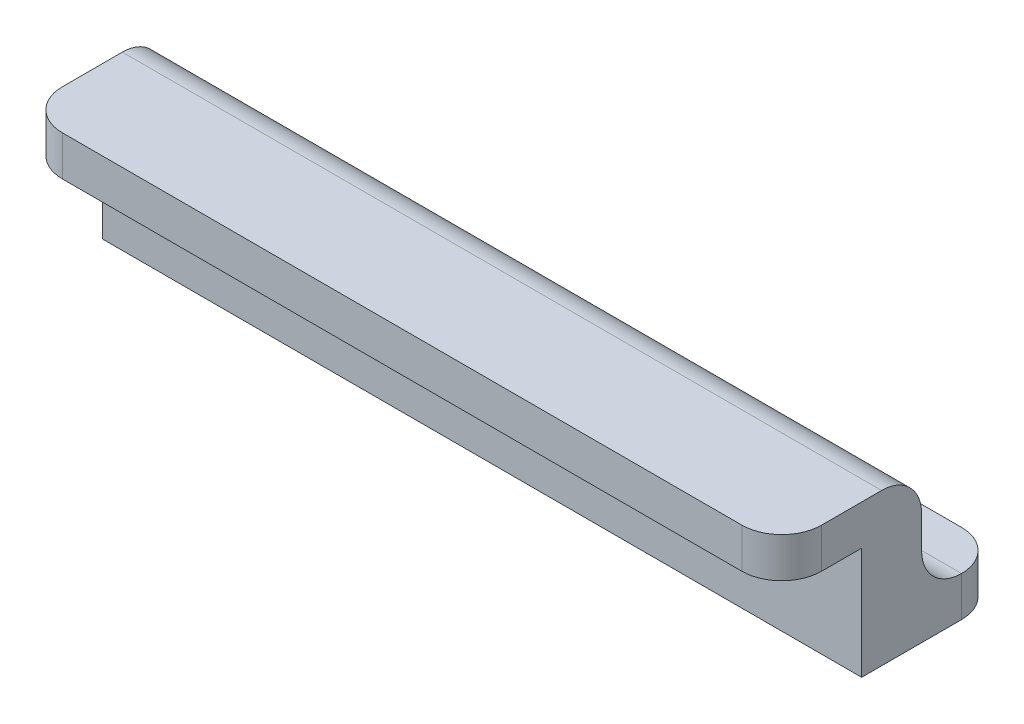
ISO-10303-21;
HEADER;
FILE_DESCRIPTION(('STEP AP214'),'2;1');
FILE_NAME('part.step','',(''),(''),'','','');
FILE_SCHEMA(('AUTOMOTIVE_DESIGN { 1 0 10303 214 1 1 1 1 }'));
ENDSEC;
DATA;
#1=APPLICATION_CONTEXT('core data for automotive mechanical design processes');
#2=APPLICATION_PROTOCOL_DEFINITION('international standard','automotive_design',2000,#1);
#3=PRODUCT_CONTEXT('',#1,'mechanical');
#4=PRODUCT('Part','Part','',(#3));
#5=PRODUCT_RELATED_PRODUCT_CATEGORY('part','',(#4));
#6=PRODUCT_DEFINITION_FORMATION('','',#4);
#7=PRODUCT_DEFINITION_CONTEXT('part definition',#1,'design');
#8=PRODUCT_DEFINITION('design','',#6,#7);
#9=PRODUCT_DEFINITION_SHAPE('','',#8);
#10=(LENGTH_UNIT() NAMED_UNIT(*) SI_UNIT(.MILLI.,.METRE.));
#11=(NAMED_UNIT(*) PLANE_ANGLE_UNIT() SI_UNIT($,.RADIAN.));
#12=(NAMED_UNIT(*) SI_UNIT($,.STERADIAN.) SOLID_ANGLE_UNIT());
#13=UNCERTAINTY_MEASURE_WITH_UNIT(LENGTH_MEASURE(1.E-05),#10,'distance_accuracy_value','');
#14=(GEOMETRIC_REPRESENTATION_CONTEXT(3) GLOBAL_UNCERTAINTY_ASSIGNED_CONTEXT((#13)) GLOBAL_UNIT_ASSIGNED_CONTEXT((#10,
#11,#12)) REPRESENTATION_CONTEXT('',''));
#15=CARTESIAN_POINT('',(0.,0.,0.));
#16=DIRECTION('',(0.,0.,1.));
#17=DIRECTION('',(1.,0.,0.));
#18=AXIS2_PLACEMENT_3D('',#15,#16,#17);
#19=CARTESIAN_POINT('',(0.,2.,-2.));
#20=DIRECTION('',(1.,0.,0.));
#21=DIRECTION('',(0.,0.,-1.));
#22=AXIS2_PLACEMENT_3D('',#19,#20,#21);
#23=PLANE('',#22);
#24=DIRECTION('',(0.,0.,1.));
#25=VECTOR('',#24,1.);
#26=CARTESIAN_POINT('',(0.,2.,-2.));
#27=LINE('',#26,#25);
#28=CARTESIAN_POINT('',(0.,2.,-5.));
#29=VERTEX_POINT('',#28);
#30=CARTESIAN_POINT('',(0.,2.,-2.));
#31=VERTEX_POINT('',#30);
#32=EDGE_CURVE('E189',#29,#31,#27,.T.);
#33=ORIENTED_EDGE('',*,*,#32,.F.);
#34=CARTESIAN_POINT('',(0.,0.,-5.));
#35=DIRECTION('',(1.,0.,0.));
#36=DIRECTION('',(0.,0.,-1.));
#37=AXIS2_PLACEMENT_3D('',#34,#35,#36);
#38=CIRCLE('',#37,2.);
#39=CARTESIAN_POINT('',(0.,0.,-7.));
#40=VERTEX_POINT('',#39);
#41=EDGE_CURVE('E222',#29,#40,#38,.F.);
#42=ORIENTED_EDGE('',*,*,#41,.T.);
#43=DIRECTION('',(0.,-1.,0.));
#44=VECTOR('',#43,1.);
#45=CARTESIAN_POINT('',(0.,40.1182371050918,-7.));
#46=LINE('',#45,#44);
#47=CARTESIAN_POINT('',(0.,-1.59999999999996,-7.));
#48=VERTEX_POINT('',#47);
#49=EDGE_CURVE('E157',#40,#48,#46,.T.);
#50=ORIENTED_EDGE('',*,*,#49,.T.);
#51=CARTESIAN_POINT('',(0.,-1.59999999999998,-9.));
#52=DIRECTION('',(1.,0.,0.));
#53=DIRECTION('',(0.,0.,-1.));
#54=AXIS2_PLACEMENT_3D('',#51,#52,#53);
#55=CIRCLE('',#54,2.);
#56=CARTESIAN_POINT('',(0.,-3.59999999999998,-9.00000000000001));
#57=VERTEX_POINT('',#56);
#58=EDGE_CURVE('E41',#48,#57,#55,.T.);
#59=ORIENTED_EDGE('',*,*,#58,.T.);
#60=DIRECTION('',(0.,-1.,0.));
#61=VECTOR('',#60,1.);
#62=CARTESIAN_POINT('',(0.,-3.59999999999998,-9.00000000000001));
#63=LINE('',#62,#61);
#64=CARTESIAN_POINT('',(0.,-5.59999999999998,-9.00000000000002));
#65=VERTEX_POINT('',#64);
#66=EDGE_CURVE('E174',#57,#65,#63,.T.);
#67=ORIENTED_EDGE('',*,*,#66,.T.);
#68=DIRECTION('',(0.,0.,1.));
#69=VECTOR('',#68,1.);
#70=CARTESIAN_POINT('',(0.,-5.6,-6.));
#71=LINE('',#70,#69);
#72=CARTESIAN_POINT('',(0.,-5.6,-4.));
#73=VERTEX_POINT('',#72);
#74=EDGE_CURVE('E138',#65,#73,#71,.T.);
#75=ORIENTED_EDGE('',*,*,#74,.T.);
#76=DIRECTION('',(0.,-1.,0.));
#77=VECTOR('',#76,1.);
#78=CARTESIAN_POINT('',(0.,40.1182371050918,-4.));
#79=LINE('',#78,#77);
#80=CARTESIAN_POINT('',(0.,0.,-4.));
#81=VERTEX_POINT('',#80);
#82=EDGE_CURVE('E148',#81,#73,#79,.T.);
#83=ORIENTED_EDGE('',*,*,#82,.F.);
#84=DIRECTION('',(0.,0.,-1.));
#85=VECTOR('',#84,1.);
#86=CARTESIAN_POINT('',(0.,0.,-5.80000000000001));
#87=LINE('',#86,#85);
#88=CARTESIAN_POINT('',(0.,0.,-2.));
#89=VERTEX_POINT('',#88);
#90=EDGE_CURVE('E162',#89,#81,#87,.T.);
#91=ORIENTED_EDGE('',*,*,#90,.F.);
#92=DIRECTION('',(0.,-1.,0.));
#93=VECTOR('',#92,1.);
#94=CARTESIAN_POINT('',(0.,2.,-2.));
#95=LINE('',#94,#93);
#96=EDGE_CURVE('E214',#31,#89,#95,.T.);
#97=ORIENTED_EDGE('',*,*,#96,.F.);
#98=EDGE_LOOP('',(#33,#42,#50,#59,#67,#75,#83,#91,#97));
#99=FACE_BOUND('',#98,.T.);
#100=ADVANCED_FACE('F33',(#99),#23,.F.);
#101=CARTESIAN_POINT('',(2.,2.,-2.));
#102=DIRECTION('',(0.,-1.,0.));
#103=DIRECTION('',(0.,0.,-1.));
#104=AXIS2_PLACEMENT_3D('',#101,#102,#103);
#105=CYLINDRICAL_SURFACE('',#104,2.);
#106=ORIENTED_EDGE('',*,*,#96,.T.);
#107=CARTESIAN_POINT('',(2.,0.,-2.));
#108=DIRECTION('',(0.,1.,0.));
#109=DIRECTION('',(0.,0.,-1.));
#110=AXIS2_PLACEMENT_3D('',#107,#108,#109);
#111=CIRCLE('',#110,2.);
#112=CARTESIAN_POINT('',(2.,0.,0.));
#113=VERTEX_POINT('',#112);
#114=EDGE_CURVE('E137',#89,#113,#111,.T.);
#115=ORIENTED_EDGE('',*,*,#114,.T.);
#116=DIRECTION('',(0.,-1.,0.));
#117=VECTOR('',#116,1.);
#118=CARTESIAN_POINT('',(2.,2.,0.));
#119=LINE('',#118,#117);
#120=CARTESIAN_POINT('',(2.,2.,0.));
#121=VERTEX_POINT('',#120);
#122=EDGE_CURVE('E211',#121,#113,#119,.T.);
#123=ORIENTED_EDGE('',*,*,#122,.F.);
#124=CARTESIAN_POINT('',(2.,2.,-2.));
#125=DIRECTION('',(0.,1.,0.));
#126=DIRECTION('',(0.,0.,-1.));
#127=AXIS2_PLACEMENT_3D('',#124,#125,#126);
#128=CIRCLE('',#127,2.);
#129=EDGE_CURVE('E191',#31,#121,#128,.T.);
#130=ORIENTED_EDGE('',*,*,#129,.F.);
#131=EDGE_LOOP('',(#106,#115,#123,#130));
#132=FACE_BOUND('',#131,.T.);
#133=ADVANCED_FACE('F258',(#132),#105,.T.);
#134=CARTESIAN_POINT('',(36.,2.,-2.));
#135=DIRECTION('',(0.,-1.,0.));
#136=DIRECTION('',(0.,0.,-1.));
#137=AXIS2_PLACEMENT_3D('',#134,#135,#136);
#138=CYLINDRICAL_SURFACE('',#137,2.);
#139=CARTESIAN_POINT('',(36.,0.,-2.));
#140=DIRECTION('',(0.,1.,0.));
#141=DIRECTION('',(0.,0.,1.));
#142=AXIS2_PLACEMENT_3D('',#139,#140,#141);
#143=CIRCLE('',#142,2.);
#144=CARTESIAN_POINT('',(36.,0.,0.));
#145=VERTEX_POINT('',#144);
#146=CARTESIAN_POINT('',(38.,0.,-2.));
#147=VERTEX_POINT('',#146);
#148=EDGE_CURVE('E192',#145,#147,#143,.T.);
#149=ORIENTED_EDGE('',*,*,#148,.T.);
#150=DIRECTION('',(0.,-1.,0.));
#151=VECTOR('',#150,1.);
#152=CARTESIAN_POINT('',(38.,2.,-2.));
#153=LINE('',#152,#151);
#154=CARTESIAN_POINT('',(38.,2.,-2.));
#155=VERTEX_POINT('',#154);
#156=EDGE_CURVE('E201',#155,#147,#153,.T.);
#157=ORIENTED_EDGE('',*,*,#156,.F.);
#158=CARTESIAN_POINT('',(36.,2.,-2.));
#159=DIRECTION('',(0.,1.,0.));
#160=DIRECTION('',(0.,0.,1.));
#161=AXIS2_PLACEMENT_3D('',#158,#159,#160);
#162=CIRCLE('',#161,2.);
#163=CARTESIAN_POINT('',(36.,2.,0.));
#164=VERTEX_POINT('',#163);
#165=EDGE_CURVE('E196',#164,#155,#162,.T.);
#166=ORIENTED_EDGE('',*,*,#165,.F.);
#167=DIRECTION('',(0.,-1.,0.));
#168=VECTOR('',#167,1.);
#169=CARTESIAN_POINT('',(36.,2.,0.));
#170=LINE('',#169,#168);
#171=EDGE_CURVE('E208',#164,#145,#170,.T.);
#172=ORIENTED_EDGE('',*,*,#171,.T.);
#173=EDGE_LOOP('',(#149,#157,#166,#172));
#174=FACE_BOUND('',#173,.T.);
#175=ADVANCED_FACE('F268',(#174),#138,.T.);
#176=CARTESIAN_POINT('',(38.,2.,-2.));
#177=DIRECTION('',(-1.,0.,0.));
#178=DIRECTION('',(0.,0.,1.));
#179=AXIS2_PLACEMENT_3D('',#176,#177,#178);
#180=PLANE('',#179);
#181=DIRECTION('',(0.,-1.,0.));
#182=VECTOR('',#181,1.);
#183=CARTESIAN_POINT('',(38.,40.1182371050918,-7.));
#184=LINE('',#183,#182);
#185=CARTESIAN_POINT('',(38.,0.,-7.));
#186=VERTEX_POINT('',#185);
#187=CARTESIAN_POINT('',(38.,-1.5999999999997,-7.));
#188=VERTEX_POINT('',#187);
#189=EDGE_CURVE('E155',#186,#188,#184,.T.);
#190=ORIENTED_EDGE('',*,*,#189,.F.);
#191=CARTESIAN_POINT('',(38.,0.,-5.));
#192=DIRECTION('',(-1.,0.,0.));
#193=DIRECTION('',(0.,0.,1.));
#194=AXIS2_PLACEMENT_3D('',#191,#192,#193);
#195=CIRCLE('',#194,2.);
#196=CARTESIAN_POINT('',(38.,2.,-5.));
#197=VERTEX_POINT('',#196);
#198=EDGE_CURVE('E228',#186,#197,#195,.F.);
#199=ORIENTED_EDGE('',*,*,#198,.T.);
#200=DIRECTION('',(0.,0.,-1.));
#201=VECTOR('',#200,1.);
#202=CARTESIAN_POINT('',(38.,2.,-2.));
#203=LINE('',#202,#201);
#204=EDGE_CURVE('E198',#155,#197,#203,.T.);
#205=ORIENTED_EDGE('',*,*,#204,.F.);
#206=ORIENTED_EDGE('',*,*,#156,.T.);
#207=DIRECTION('',(0.,0.,1.));
#208=VECTOR('',#207,1.);
#209=CARTESIAN_POINT('',(38.,0.,-5.8));
#210=LINE('',#209,#208);
#211=CARTESIAN_POINT('',(38.,0.,-4.));
#212=VERTEX_POINT('',#211);
#213=EDGE_CURVE('E145',#212,#147,#210,.T.);
#214=ORIENTED_EDGE('',*,*,#213,.F.);
#215=DIRECTION('',(0.,-1.,0.));
#216=VECTOR('',#215,1.);
#217=CARTESIAN_POINT('',(38.,40.1182371050918,-4.));
#218=LINE('',#217,#216);
#219=CARTESIAN_POINT('',(38.,-5.6,-4.));
#220=VERTEX_POINT('',#219);
#221=EDGE_CURVE('E142',#212,#220,#218,.T.);
#222=ORIENTED_EDGE('',*,*,#221,.T.);
#223=DIRECTION('',(0.,0.,-1.));
#224=VECTOR('',#223,1.);
#225=CARTESIAN_POINT('',(38.,-5.6,-6.));
#226=LINE('',#225,#224);
#227=CARTESIAN_POINT('',(38.,-5.59999999999971,-9.00000000000002));
#228=VERTEX_POINT('',#227);
#229=EDGE_CURVE('E128',#220,#228,#226,.T.);
#230=ORIENTED_EDGE('',*,*,#229,.T.);
#231=DIRECTION('',(0.,-1.,0.));
#232=VECTOR('',#231,1.);
#233=CARTESIAN_POINT('',(38.,-3.59999999999971,-9.00000000000001));
#234=LINE('',#233,#232);
#235=CARTESIAN_POINT('',(38.,-3.59999999999971,-9.00000000000001));
#236=VERTEX_POINT('',#235);
#237=EDGE_CURVE('E180',#236,#228,#234,.T.);
#238=ORIENTED_EDGE('',*,*,#237,.F.);
#239=CARTESIAN_POINT('',(38.,-1.59999999999971,-9.));
#240=DIRECTION('',(-1.,0.,0.));
#241=DIRECTION('',(0.,0.,1.));
#242=AXIS2_PLACEMENT_3D('',#239,#240,#241);
#243=CIRCLE('',#242,2.);
#244=EDGE_CURVE('E11',#236,#188,#243,.T.);
#245=ORIENTED_EDGE('',*,*,#244,.T.);
#246=EDGE_LOOP('',(#190,#199,#205,#206,#214,#222,#230,#238,#245));
#247=FACE_BOUND('',#246,.T.);
#248=ADVANCED_FACE('F143',(#247),#180,.F.);
#249=CARTESIAN_POINT('',(1.,-5.6,-6.));
#250=DIRECTION('',(0.,1.,0.));
#251=DIRECTION('',(0.,0.,1.));
#252=AXIS2_PLACEMENT_3D('',#249,#250,#251);
#253=PLANE('',#252);
#254=CARTESIAN_POINT('',(36.,-5.59999999999973,-9.00000000000002));
#255=DIRECTION('',(0.,-1.,0.));
#256=DIRECTION('',(1.,0.,0.));
#257=AXIS2_PLACEMENT_3D('',#254,#255,#256);
#258=CIRCLE('',#257,2.);
#259=CARTESIAN_POINT('',(36.,-5.59999999999972,-11.));
#260=VERTEX_POINT('',#259);
#261=EDGE_CURVE('E135',#260,#228,#258,.T.);
#262=ORIENTED_EDGE('',*,*,#261,.T.);
#263=ORIENTED_EDGE('',*,*,#229,.F.);
#264=DIRECTION('',(-1.,0.,0.));
#265=VECTOR('',#264,1.);
#266=CARTESIAN_POINT('',(38.,-5.6,-4.));
#267=LINE('',#266,#265);
#268=EDGE_CURVE('E132',#220,#73,#267,.T.);
#269=ORIENTED_EDGE('',*,*,#268,.T.);
#270=ORIENTED_EDGE('',*,*,#74,.F.);
#271=CARTESIAN_POINT('',(2.,-5.59999999999997,-9.00000000000002));
#272=DIRECTION('',(0.,-1.,0.));
#273=DIRECTION('',(1.,0.,0.));
#274=AXIS2_PLACEMENT_3D('',#271,#272,#273);
#275=CIRCLE('',#274,2.);
#276=CARTESIAN_POINT('',(2.,-5.59999999999996,-11.));
#277=VERTEX_POINT('',#276);
#278=EDGE_CURVE('E164',#65,#277,#275,.T.);
#279=ORIENTED_EDGE('',*,*,#278,.T.);
#280=DIRECTION('',(1.,0.,0.));
#281=VECTOR('',#280,1.);
#282=CARTESIAN_POINT('',(2.,-5.59999999999996,-11.));
#283=LINE('',#282,#281);
#284=EDGE_CURVE('E177',#277,#260,#283,.T.);
#285=ORIENTED_EDGE('',*,*,#284,.T.);
#286=EDGE_LOOP('',(#262,#263,#269,#270,#279,#285));
#287=FACE_BOUND('',#286,.T.);
#288=ADVANCED_FACE('F130',(#287),#253,.F.);
#289=CARTESIAN_POINT('',(1.,2.,-7.));
#290=DIRECTION('',(0.,0.,1.));
#291=DIRECTION('',(1.,0.,0.));
#292=AXIS2_PLACEMENT_3D('',#289,#290,#291);
#293=PLANE('',#292);
#294=ORIENTED_EDGE('',*,*,#49,.F.);
#295=DIRECTION('',(-1.,0.,0.));
#296=VECTOR('',#295,1.);
#297=CARTESIAN_POINT('',(1.,0.,-7.));
#298=LINE('',#297,#296);
#299=EDGE_CURVE('E53',#40,#186,#298,.F.);
#300=ORIENTED_EDGE('',*,*,#299,.T.);
#301=ORIENTED_EDGE('',*,*,#189,.T.);
#302=DIRECTION('',(-1.,0.,0.));
#303=VECTOR('',#302,1.);
#304=CARTESIAN_POINT('',(0.,-1.59999999999998,-7.));
#305=LINE('',#304,#303);
#306=EDGE_CURVE('E224',#188,#48,#305,.T.);
#307=ORIENTED_EDGE('',*,*,#306,.T.);
#308=EDGE_LOOP('',(#294,#300,#301,#307));
#309=FACE_BOUND('',#308,.T.);
#310=ADVANCED_FACE('F245',(#309),#293,.F.);
#311=CARTESIAN_POINT('',(2.,2.,0.));
#312=DIRECTION('',(0.,0.,-1.));
#313=DIRECTION('',(-1.,0.,0.));
#314=AXIS2_PLACEMENT_3D('',#311,#312,#313);
#315=PLANE('',#314);
#316=DIRECTION('',(1.,0.,0.));
#317=VECTOR('',#316,1.);
#318=CARTESIAN_POINT('',(2.,0.,0.));
#319=LINE('',#318,#317);
#320=EDGE_CURVE('E203',#113,#145,#319,.T.);
#321=ORIENTED_EDGE('',*,*,#320,.T.);
#322=ORIENTED_EDGE('',*,*,#171,.F.);
#323=DIRECTION('',(1.,0.,0.));
#324=VECTOR('',#323,1.);
#325=CARTESIAN_POINT('',(2.,2.,0.));
#326=LINE('',#325,#324);
#327=EDGE_CURVE('E194',#121,#164,#326,.T.);
#328=ORIENTED_EDGE('',*,*,#327,.F.);
#329=ORIENTED_EDGE('',*,*,#122,.T.);
#330=EDGE_LOOP('',(#321,#322,#328,#329));
#331=FACE_BOUND('',#330,.T.);
#332=ADVANCED_FACE('F264',(#331),#315,.F.);
#333=CARTESIAN_POINT('',(37.,2.,-6.));
#334=DIRECTION('',(0.,-1.,0.));
#335=DIRECTION('',(0.,0.,-1.));
#336=AXIS2_PLACEMENT_3D('',#333,#334,#335);
#337=PLANE('',#336);
#338=ORIENTED_EDGE('',*,*,#204,.T.);
#339=DIRECTION('',(-1.,0.,0.));
#340=VECTOR('',#339,1.);
#341=CARTESIAN_POINT('',(37.,2.,-5.));
#342=LINE('',#341,#340);
#343=EDGE_CURVE('E219',#197,#29,#342,.T.);
#344=ORIENTED_EDGE('',*,*,#343,.T.);
#345=ORIENTED_EDGE('',*,*,#32,.T.);
#346=ORIENTED_EDGE('',*,*,#129,.T.);
#347=ORIENTED_EDGE('',*,*,#327,.T.);
#348=ORIENTED_EDGE('',*,*,#165,.T.);
#349=EDGE_LOOP('',(#338,#344,#345,#346,#347,#348));
#350=FACE_BOUND('',#349,.T.);
#351=ADVANCED_FACE('F252',(#350),#337,.F.);
#352=CARTESIAN_POINT('',(37.,0.,-6.));
#353=DIRECTION('',(0.,-1.,0.));
#354=DIRECTION('',(0.,0.,-1.));
#355=AXIS2_PLACEMENT_3D('',#352,#353,#354);
#356=PLANE('',#355);
#357=DIRECTION('',(-1.,0.,0.));
#358=VECTOR('',#357,1.);
#359=CARTESIAN_POINT('',(37.,0.,-4.));
#360=LINE('',#359,#358);
#361=EDGE_CURVE('E217',#212,#81,#360,.T.);
#362=ORIENTED_EDGE('',*,*,#361,.F.);
#363=ORIENTED_EDGE('',*,*,#213,.T.);
#364=ORIENTED_EDGE('',*,*,#148,.F.);
#365=ORIENTED_EDGE('',*,*,#320,.F.);
#366=ORIENTED_EDGE('',*,*,#114,.F.);
#367=ORIENTED_EDGE('',*,*,#90,.T.);
#368=EDGE_LOOP('',(#362,#363,#364,#365,#366,#367));
#369=FACE_BOUND('',#368,.T.);
#370=ADVANCED_FACE('F270',(#369),#356,.T.);
#371=CARTESIAN_POINT('',(36.,-3.59999999999973,-9.00000000000001));
#372=DIRECTION('',(0.,-1.,0.));
#373=DIRECTION('',(1.,0.,0.));
#374=AXIS2_PLACEMENT_3D('',#371,#372,#373);
#375=CYLINDRICAL_SURFACE('',#374,2.);
#376=ORIENTED_EDGE('',*,*,#261,.F.);
#377=DIRECTION('',(0.,-1.,0.));
#378=VECTOR('',#377,1.);
#379=CARTESIAN_POINT('',(36.,-3.59999999999972,-11.));
#380=LINE('',#379,#378);
#381=CARTESIAN_POINT('',(36.,-3.59999999999972,-11.));
#382=VERTEX_POINT('',#381);
#383=EDGE_CURVE('E182',#382,#260,#380,.T.);
#384=ORIENTED_EDGE('',*,*,#383,.F.);
#385=CARTESIAN_POINT('',(36.,-3.59999999999973,-9.00000000000001));
#386=DIRECTION('',(0.,-1.,0.));
#387=DIRECTION('',(1.,0.,0.));
#388=AXIS2_PLACEMENT_3D('',#385,#386,#387);
#389=CIRCLE('',#388,2.);
#390=EDGE_CURVE('E171',#382,#236,#389,.T.);
#391=ORIENTED_EDGE('',*,*,#390,.T.);
#392=ORIENTED_EDGE('',*,*,#237,.T.);
#393=EDGE_LOOP('',(#376,#384,#391,#392));
#394=FACE_BOUND('',#393,.T.);
#395=ADVANCED_FACE('F275',(#394),#375,.T.);
#396=CARTESIAN_POINT('',(1.99999999999999,-3.59999999999996,-11.));
#397=DIRECTION('',(0.,0.,-1.));
#398=DIRECTION('',(0.,1.,0.));
#399=AXIS2_PLACEMENT_3D('',#396,#397,#398);
#400=PLANE('',#399);
#401=ORIENTED_EDGE('',*,*,#284,.F.);
#402=DIRECTION('',(0.,-1.,0.));
#403=VECTOR('',#402,1.);
#404=CARTESIAN_POINT('',(1.99999999999999,-3.59999999999996,-11.));
#405=LINE('',#404,#403);
#406=CARTESIAN_POINT('',(1.99999999999999,-3.59999999999996,-11.));
#407=VERTEX_POINT('',#406);
#408=EDGE_CURVE('E184',#407,#277,#405,.T.);
#409=ORIENTED_EDGE('',*,*,#408,.F.);
#410=DIRECTION('',(1.,0.,0.));
#411=VECTOR('',#410,1.);
#412=CARTESIAN_POINT('',(1.99999999999999,-3.59999999999996,-11.));
#413=LINE('',#412,#411);
#414=EDGE_CURVE('E168',#407,#382,#413,.T.);
#415=ORIENTED_EDGE('',*,*,#414,.T.);
#416=ORIENTED_EDGE('',*,*,#383,.T.);
#417=EDGE_LOOP('',(#401,#409,#415,#416));
#418=FACE_BOUND('',#417,.T.);
#419=ADVANCED_FACE('F273',(#418),#400,.T.);
#420=CARTESIAN_POINT('',(1.99999999999999,-3.59999999999997,-9.00000000000001));
#421=DIRECTION('',(0.,-1.,0.));
#422=DIRECTION('',(1.,0.,0.));
#423=AXIS2_PLACEMENT_3D('',#420,#421,#422);
#424=CYLINDRICAL_SURFACE('',#423,2.);
#425=ORIENTED_EDGE('',*,*,#278,.F.);
#426=ORIENTED_EDGE('',*,*,#66,.F.);
#427=CARTESIAN_POINT('',(1.99999999999999,-3.59999999999997,-9.00000000000001));
#428=DIRECTION('',(0.,-1.,0.));
#429=DIRECTION('',(1.,0.,0.));
#430=AXIS2_PLACEMENT_3D('',#427,#428,#429);
#431=CIRCLE('',#430,2.);
#432=EDGE_CURVE('E165',#57,#407,#431,.T.);
#433=ORIENTED_EDGE('',*,*,#432,.T.);
#434=ORIENTED_EDGE('',*,*,#408,.T.);
#435=EDGE_LOOP('',(#425,#426,#433,#434));
#436=FACE_BOUND('',#435,.T.);
#437=ADVANCED_FACE('F240',(#436),#424,.T.);
#438=CARTESIAN_POINT('',(37.,-3.59999999999973,-6.00000000000001));
#439=DIRECTION('',(0.,-1.,0.));
#440=DIRECTION('',(1.,0.,0.));
#441=AXIS2_PLACEMENT_3D('',#438,#439,#440);
#442=PLANE('',#441);
#443=ORIENTED_EDGE('',*,*,#432,.F.);
#444=DIRECTION('',(-1.,0.,0.));
#445=VECTOR('',#444,1.);
#446=CARTESIAN_POINT('',(38.,-3.59999999999971,-9.00000000000001));
#447=LINE('',#446,#445);
#448=EDGE_CURVE('E230',#57,#236,#447,.F.);
#449=ORIENTED_EDGE('',*,*,#448,.T.);
#450=ORIENTED_EDGE('',*,*,#390,.F.);
#451=ORIENTED_EDGE('',*,*,#414,.F.);
#452=EDGE_LOOP('',(#443,#449,#450,#451));
#453=FACE_BOUND('',#452,.T.);
#454=ADVANCED_FACE('F243',(#453),#442,.F.);
#455=CARTESIAN_POINT('',(38.,40.1182371050918,-4.));
#456=DIRECTION('',(0.,0.,1.));
#457=DIRECTION('',(1.,0.,0.));
#458=AXIS2_PLACEMENT_3D('',#455,#456,#457);
#459=PLANE('',#458);
#460=ORIENTED_EDGE('',*,*,#221,.F.);
#461=ORIENTED_EDGE('',*,*,#361,.T.);
#462=ORIENTED_EDGE('',*,*,#82,.T.);
#463=ORIENTED_EDGE('',*,*,#268,.F.);
#464=EDGE_LOOP('',(#460,#461,#462,#463));
#465=FACE_BOUND('',#464,.T.);
#466=ADVANCED_FACE('F151',(#465),#459,.T.);
#467=CARTESIAN_POINT('',(37.,0.,-5.));
#468=DIRECTION('',(-1.,0.,0.));
#469=DIRECTION('',(0.,0.,1.));
#470=AXIS2_PLACEMENT_3D('',#467,#468,#469);
#471=CYLINDRICAL_SURFACE('',#470,2.);
#472=ORIENTED_EDGE('',*,*,#198,.F.);
#473=ORIENTED_EDGE('',*,*,#299,.F.);
#474=ORIENTED_EDGE('',*,*,#41,.F.);
#475=ORIENTED_EDGE('',*,*,#343,.F.);
#476=EDGE_LOOP('',(#472,#473,#474,#475));
#477=FACE_BOUND('',#476,.T.);
#478=ADVANCED_FACE('F250',(#477),#471,.T.);
#479=CARTESIAN_POINT('',(1.00000000000003,-1.59999999999997,-9.));
#480=DIRECTION('',(1.,0.,0.));
#481=DIRECTION('',(0.,1.,0.));
#482=AXIS2_PLACEMENT_3D('',#479,#480,#481);
#483=CYLINDRICAL_SURFACE('',#482,2.);
#484=ORIENTED_EDGE('',*,*,#244,.F.);
#485=ORIENTED_EDGE('',*,*,#448,.F.);
#486=ORIENTED_EDGE('',*,*,#58,.F.);
#487=ORIENTED_EDGE('',*,*,#306,.F.);
#488=EDGE_LOOP('',(#484,#485,#486,#487));
#489=FACE_BOUND('',#488,.T.);
#490=ADVANCED_FACE('F35',(#489),#483,.F.);
#491=CLOSED_SHELL('',(#100,#133,#175,#248,#288,#310,#332,#351,#370,#395,#419,#437,#454,#466,
#478,#490));
#492=MANIFOLD_SOLID_BREP('B2',#491);
#493=ADVANCED_BREP_SHAPE_REPRESENTATION('',(#18,#492),#14);
#494=SHAPE_DEFINITION_REPRESENTATION(#9,#493);
ENDSEC;
END-ISO-10303-21;
